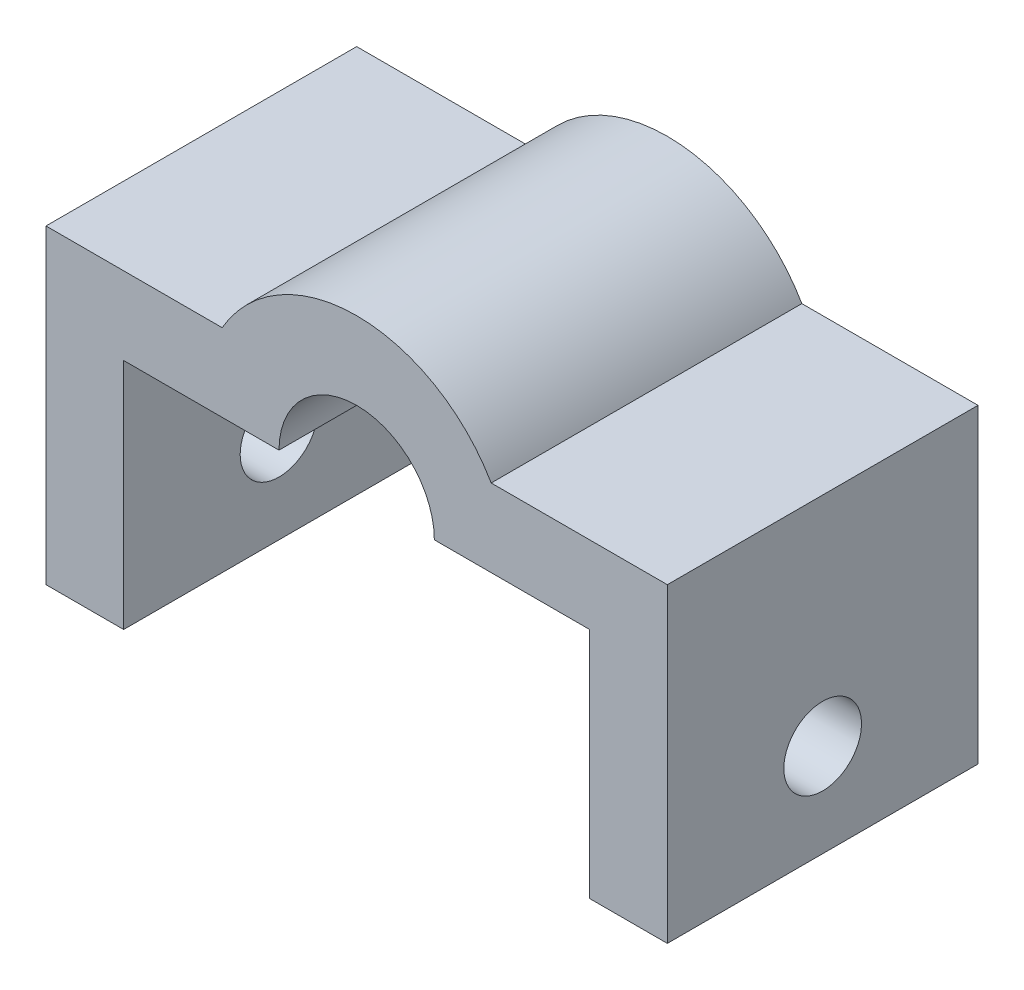
ISO-10303-21;
HEADER;
FILE_DESCRIPTION(('STEP AP214'),'2;1');
FILE_NAME('part.step','',(''),(''),'','','');
FILE_SCHEMA(('AUTOMOTIVE_DESIGN { 1 0 10303 214 1 1 1 1 }'));
ENDSEC;
DATA;
#1=APPLICATION_CONTEXT('core data for automotive mechanical design processes');
#2=APPLICATION_PROTOCOL_DEFINITION('international standard','automotive_design',2000,#1);
#3=PRODUCT_CONTEXT('',#1,'mechanical');
#4=PRODUCT('Part','Part','',(#3));
#5=PRODUCT_RELATED_PRODUCT_CATEGORY('part','',(#4));
#6=PRODUCT_DEFINITION_FORMATION('','',#4);
#7=PRODUCT_DEFINITION_CONTEXT('part definition',#1,'design');
#8=PRODUCT_DEFINITION('design','',#6,#7);
#9=PRODUCT_DEFINITION_SHAPE('','',#8);
#10=(LENGTH_UNIT() NAMED_UNIT(*) SI_UNIT(.MILLI.,.METRE.));
#11=(NAMED_UNIT(*) PLANE_ANGLE_UNIT() SI_UNIT($,.RADIAN.));
#12=(NAMED_UNIT(*) SI_UNIT($,.STERADIAN.) SOLID_ANGLE_UNIT());
#13=UNCERTAINTY_MEASURE_WITH_UNIT(LENGTH_MEASURE(1.E-05),#10,'distance_accuracy_value','');
#14=(GEOMETRIC_REPRESENTATION_CONTEXT(3) GLOBAL_UNCERTAINTY_ASSIGNED_CONTEXT((#13)) GLOBAL_UNIT_ASSIGNED_CONTEXT((#10,
#11,#12)) REPRESENTATION_CONTEXT('',''));
#15=CARTESIAN_POINT('',(0.,0.,0.));
#16=DIRECTION('',(0.,0.,1.));
#17=DIRECTION('',(1.,0.,0.));
#18=AXIS2_PLACEMENT_3D('',#15,#16,#17);
#19=CARTESIAN_POINT('',(-3.175,0.,12.7));
#20=DIRECTION('',(-1.,0.,0.));
#21=DIRECTION('',(0.,0.,1.));
#22=AXIS2_PLACEMENT_3D('',#19,#20,#21);
#23=PLANE('',#22);
#24=CARTESIAN_POINT('',(-3.175,3.81,6.35));
#25=DIRECTION('',(-1.,0.,0.));
#26=DIRECTION('',(0.,0.,1.));
#27=AXIS2_PLACEMENT_3D('',#24,#25,#26);
#28=CIRCLE('',#27,1.5875);
#29=CARTESIAN_POINT('',(-3.175,3.81,7.9375));
#30=VERTEX_POINT('',#29);
#31=EDGE_CURVE('E305',#30,#30,#28,.T.);
#32=ORIENTED_EDGE('',*,*,#31,.F.);
#33=EDGE_LOOP('',(#32));
#34=FACE_BOUND('',#33,.T.);
#35=DIRECTION('',(0.,1.,0.));
#36=VECTOR('',#35,1.);
#37=CARTESIAN_POINT('',(-3.175,0.,0.));
#38=LINE('',#37,#36);
#39=CARTESIAN_POINT('',(-3.175,0.,0.));
#40=VERTEX_POINT('',#39);
#41=CARTESIAN_POINT('',(-3.175,12.7,0.));
#42=VERTEX_POINT('',#41);
#43=EDGE_CURVE('E167',#40,#42,#38,.T.);
#44=ORIENTED_EDGE('',*,*,#43,.F.);
#45=DIRECTION('',(0.,0.,-1.));
#46=VECTOR('',#45,1.);
#47=CARTESIAN_POINT('',(-3.175,0.,12.7));
#48=LINE('',#47,#46);
#49=CARTESIAN_POINT('',(-3.175,0.,12.7));
#50=VERTEX_POINT('',#49);
#51=EDGE_CURVE('E11',#50,#40,#48,.T.);
#52=ORIENTED_EDGE('',*,*,#51,.F.);
#53=DIRECTION('',(0.,1.,0.));
#54=VECTOR('',#53,1.);
#55=CARTESIAN_POINT('',(-3.175,0.,12.7));
#56=LINE('',#55,#54);
#57=CARTESIAN_POINT('',(-3.175,12.7,12.7));
#58=VERTEX_POINT('',#57);
#59=EDGE_CURVE('E207',#50,#58,#56,.T.);
#60=ORIENTED_EDGE('',*,*,#59,.T.);
#61=DIRECTION('',(0.,0.,-1.));
#62=VECTOR('',#61,1.);
#63=CARTESIAN_POINT('',(-3.175,12.7,12.7));
#64=LINE('',#63,#62);
#65=EDGE_CURVE('E107',#58,#42,#64,.T.);
#66=ORIENTED_EDGE('',*,*,#65,.T.);
#67=EDGE_LOOP('',(#44,#52,#60,#66));
#68=FACE_BOUND('',#67,.T.);
#69=ADVANCED_FACE('F39',(#34,#68),#23,.T.);
#70=CARTESIAN_POINT('',(0.,0.,12.7));
#71=DIRECTION('',(0.,-1.,0.));
#72=DIRECTION('',(1.,0.,0.));
#73=AXIS2_PLACEMENT_3D('',#70,#71,#72);
#74=PLANE('',#73);
#75=DIRECTION('',(-1.,0.,0.));
#76=VECTOR('',#75,1.);
#77=CARTESIAN_POINT('',(0.,0.,0.));
#78=LINE('',#77,#76);
#79=CARTESIAN_POINT('',(0.,0.,0.));
#80=VERTEX_POINT('',#79);
#81=EDGE_CURVE('E204',#80,#40,#78,.T.);
#82=ORIENTED_EDGE('',*,*,#81,.F.);
#83=DIRECTION('',(0.,0.,-1.));
#84=VECTOR('',#83,1.);
#85=CARTESIAN_POINT('',(0.,0.,12.7));
#86=LINE('',#85,#84);
#87=CARTESIAN_POINT('',(0.,0.,12.7));
#88=VERTEX_POINT('',#87);
#89=EDGE_CURVE('E49',#88,#80,#86,.T.);
#90=ORIENTED_EDGE('',*,*,#89,.F.);
#91=DIRECTION('',(-1.,0.,0.));
#92=VECTOR('',#91,1.);
#93=CARTESIAN_POINT('',(0.,0.,12.7));
#94=LINE('',#93,#92);
#95=EDGE_CURVE('E142',#88,#50,#94,.T.);
#96=ORIENTED_EDGE('',*,*,#95,.T.);
#97=ORIENTED_EDGE('',*,*,#51,.T.);
#98=EDGE_LOOP('',(#82,#90,#96,#97));
#99=FACE_BOUND('',#98,.T.);
#100=ADVANCED_FACE('F244',(#99),#74,.T.);
#101=CARTESIAN_POINT('',(0.,0.,12.7));
#102=DIRECTION('',(-1.,0.,0.));
#103=DIRECTION('',(0.,0.,1.));
#104=AXIS2_PLACEMENT_3D('',#101,#102,#103);
#105=PLANE('',#104);
#106=CARTESIAN_POINT('',(0.,3.81,6.35));
#107=DIRECTION('',(-1.,0.,0.));
#108=DIRECTION('',(0.,0.,1.));
#109=AXIS2_PLACEMENT_3D('',#106,#107,#108);
#110=CIRCLE('',#109,1.5875);
#111=CARTESIAN_POINT('',(0.,3.81,7.9375));
#112=VERTEX_POINT('',#111);
#113=EDGE_CURVE('E172',#112,#112,#110,.T.);
#114=ORIENTED_EDGE('',*,*,#113,.T.);
#115=EDGE_LOOP('',(#114));
#116=FACE_BOUND('',#115,.T.);
#117=DIRECTION('',(0.,1.,0.));
#118=VECTOR('',#117,1.);
#119=CARTESIAN_POINT('',(0.,0.,0.));
#120=LINE('',#119,#118);
#121=CARTESIAN_POINT('',(0.,9.525,0.));
#122=VERTEX_POINT('',#121);
#123=EDGE_CURVE('E148',#80,#122,#120,.T.);
#124=ORIENTED_EDGE('',*,*,#123,.T.);
#125=DIRECTION('',(0.,0.,-1.));
#126=VECTOR('',#125,1.);
#127=CARTESIAN_POINT('',(0.,9.525,12.7));
#128=LINE('',#127,#126);
#129=CARTESIAN_POINT('',(0.,9.525,12.7));
#130=VERTEX_POINT('',#129);
#131=EDGE_CURVE('E146',#130,#122,#128,.T.);
#132=ORIENTED_EDGE('',*,*,#131,.F.);
#133=DIRECTION('',(0.,1.,0.));
#134=VECTOR('',#133,1.);
#135=CARTESIAN_POINT('',(0.,0.,12.7));
#136=LINE('',#135,#134);
#137=EDGE_CURVE('E135',#88,#130,#136,.T.);
#138=ORIENTED_EDGE('',*,*,#137,.F.);
#139=ORIENTED_EDGE('',*,*,#89,.T.);
#140=EDGE_LOOP('',(#124,#132,#138,#139));
#141=FACE_BOUND('',#140,.T.);
#142=ADVANCED_FACE('F147',(#116,#141),#105,.F.);
#143=CARTESIAN_POINT('',(0.,9.525,12.7));
#144=DIRECTION('',(0.,1.,0.));
#145=DIRECTION('',(0.,0.,1.));
#146=AXIS2_PLACEMENT_3D('',#143,#144,#145);
#147=PLANE('',#146);
#148=DIRECTION('',(1.,0.,0.));
#149=VECTOR('',#148,1.);
#150=CARTESIAN_POINT('',(0.,9.525,0.));
#151=LINE('',#150,#149);
#152=CARTESIAN_POINT('',(6.35,9.525,0.));
#153=VERTEX_POINT('',#152);
#154=EDGE_CURVE('E199',#122,#153,#151,.T.);
#155=ORIENTED_EDGE('',*,*,#154,.T.);
#156=DIRECTION('',(0.,0.,-1.));
#157=VECTOR('',#156,1.);
#158=CARTESIAN_POINT('',(6.35,9.525,12.7));
#159=LINE('',#158,#157);
#160=CARTESIAN_POINT('',(6.35,9.525,12.7));
#161=VERTEX_POINT('',#160);
#162=EDGE_CURVE('E153',#161,#153,#159,.T.);
#163=ORIENTED_EDGE('',*,*,#162,.F.);
#164=DIRECTION('',(1.,0.,0.));
#165=VECTOR('',#164,1.);
#166=CARTESIAN_POINT('',(0.,9.525,12.7));
#167=LINE('',#166,#165);
#168=EDGE_CURVE('E140',#130,#161,#167,.T.);
#169=ORIENTED_EDGE('',*,*,#168,.F.);
#170=ORIENTED_EDGE('',*,*,#131,.T.);
#171=EDGE_LOOP('',(#155,#163,#169,#170));
#172=FACE_BOUND('',#171,.T.);
#173=ADVANCED_FACE('F155',(#172),#147,.F.);
#174=CARTESIAN_POINT('',(9.525,9.525,12.7));
#175=DIRECTION('',(0.,0.,-1.));
#176=DIRECTION('',(-1.,0.,0.));
#177=AXIS2_PLACEMENT_3D('',#174,#175,#176);
#178=CYLINDRICAL_SURFACE('',#177,3.175);
#179=CARTESIAN_POINT('',(9.525,9.525,0.));
#180=DIRECTION('',(0.,0.,1.));
#181=DIRECTION('',(1.,0.,0.));
#182=AXIS2_PLACEMENT_3D('',#179,#180,#181);
#183=CIRCLE('',#182,3.175);
#184=CARTESIAN_POINT('',(12.7,9.525,0.));
#185=VERTEX_POINT('',#184);
#186=EDGE_CURVE('E195',#185,#153,#183,.T.);
#187=ORIENTED_EDGE('',*,*,#186,.F.);
#188=DIRECTION('',(0.,0.,-1.));
#189=VECTOR('',#188,1.);
#190=CARTESIAN_POINT('',(12.7,9.525,12.7));
#191=LINE('',#190,#189);
#192=CARTESIAN_POINT('',(12.7,9.525,12.7));
#193=VERTEX_POINT('',#192);
#194=EDGE_CURVE('E213',#193,#185,#191,.T.);
#195=ORIENTED_EDGE('',*,*,#194,.F.);
#196=CARTESIAN_POINT('',(9.525,9.525,12.7));
#197=DIRECTION('',(0.,0.,1.));
#198=DIRECTION('',(1.,0.,0.));
#199=AXIS2_PLACEMENT_3D('',#196,#197,#198);
#200=CIRCLE('',#199,3.175);
#201=EDGE_CURVE('E158',#193,#161,#200,.T.);
#202=ORIENTED_EDGE('',*,*,#201,.T.);
#203=ORIENTED_EDGE('',*,*,#162,.T.);
#204=EDGE_LOOP('',(#187,#195,#202,#203));
#205=FACE_BOUND('',#204,.T.);
#206=ADVANCED_FACE('F259',(#205),#178,.F.);
#207=CARTESIAN_POINT('',(12.7,9.525,12.7));
#208=DIRECTION('',(0.,1.,0.));
#209=DIRECTION('',(0.,0.,1.));
#210=AXIS2_PLACEMENT_3D('',#207,#208,#209);
#211=PLANE('',#210);
#212=DIRECTION('',(1.,0.,0.));
#213=VECTOR('',#212,1.);
#214=CARTESIAN_POINT('',(12.7,9.525,0.));
#215=LINE('',#214,#213);
#216=CARTESIAN_POINT('',(19.05,9.525,0.));
#217=VERTEX_POINT('',#216);
#218=EDGE_CURVE('E192',#185,#217,#215,.T.);
#219=ORIENTED_EDGE('',*,*,#218,.T.);
#220=DIRECTION('',(0.,0.,-1.));
#221=VECTOR('',#220,1.);
#222=CARTESIAN_POINT('',(19.05,9.525,12.7));
#223=LINE('',#222,#221);
#224=CARTESIAN_POINT('',(19.05,9.525,12.7));
#225=VERTEX_POINT('',#224);
#226=EDGE_CURVE('E216',#225,#217,#223,.T.);
#227=ORIENTED_EDGE('',*,*,#226,.F.);
#228=DIRECTION('',(1.,0.,0.));
#229=VECTOR('',#228,1.);
#230=CARTESIAN_POINT('',(12.7,9.525,12.7));
#231=LINE('',#230,#229);
#232=EDGE_CURVE('E161',#193,#225,#231,.T.);
#233=ORIENTED_EDGE('',*,*,#232,.F.);
#234=ORIENTED_EDGE('',*,*,#194,.T.);
#235=EDGE_LOOP('',(#219,#227,#233,#234));
#236=FACE_BOUND('',#235,.T.);
#237=ADVANCED_FACE('F262',(#236),#211,.F.);
#238=CARTESIAN_POINT('',(19.05,9.525,12.7));
#239=DIRECTION('',(1.,0.,0.));
#240=DIRECTION('',(0.,0.,-1.));
#241=AXIS2_PLACEMENT_3D('',#238,#239,#240);
#242=PLANE('',#241);
#243=CARTESIAN_POINT('',(19.05,3.81,6.35));
#244=DIRECTION('',(1.,0.,0.));
#245=DIRECTION('',(0.,0.,-1.));
#246=AXIS2_PLACEMENT_3D('',#243,#244,#245);
#247=CIRCLE('',#246,1.5875);
#248=CARTESIAN_POINT('',(19.05,3.81,7.9375));
#249=VERTEX_POINT('',#248);
#250=EDGE_CURVE('E309',#249,#249,#247,.T.);
#251=ORIENTED_EDGE('',*,*,#250,.T.);
#252=EDGE_LOOP('',(#251));
#253=FACE_BOUND('',#252,.T.);
#254=DIRECTION('',(0.,-1.,0.));
#255=VECTOR('',#254,1.);
#256=CARTESIAN_POINT('',(19.05,9.525,0.));
#257=LINE('',#256,#255);
#258=CARTESIAN_POINT('',(19.05,0.,0.));
#259=VERTEX_POINT('',#258);
#260=EDGE_CURVE('E189',#217,#259,#257,.T.);
#261=ORIENTED_EDGE('',*,*,#260,.T.);
#262=DIRECTION('',(0.,0.,-1.));
#263=VECTOR('',#262,1.);
#264=CARTESIAN_POINT('',(19.05,0.,12.7));
#265=LINE('',#264,#263);
#266=CARTESIAN_POINT('',(19.05,0.,12.7));
#267=VERTEX_POINT('',#266);
#268=EDGE_CURVE('E220',#267,#259,#265,.T.);
#269=ORIENTED_EDGE('',*,*,#268,.F.);
#270=DIRECTION('',(0.,-1.,0.));
#271=VECTOR('',#270,1.);
#272=CARTESIAN_POINT('',(19.05,9.525,12.7));
#273=LINE('',#272,#271);
#274=EDGE_CURVE('E333',#225,#267,#273,.T.);
#275=ORIENTED_EDGE('',*,*,#274,.F.);
#276=ORIENTED_EDGE('',*,*,#226,.T.);
#277=EDGE_LOOP('',(#261,#269,#275,#276));
#278=FACE_BOUND('',#277,.T.);
#279=ADVANCED_FACE('F266',(#253,#278),#242,.F.);
#280=CARTESIAN_POINT('',(19.05,0.,12.7));
#281=DIRECTION('',(0.,1.,0.));
#282=DIRECTION('',(0.,0.,1.));
#283=AXIS2_PLACEMENT_3D('',#280,#281,#282);
#284=PLANE('',#283);
#285=DIRECTION('',(1.,0.,0.));
#286=VECTOR('',#285,1.);
#287=CARTESIAN_POINT('',(19.05,0.,0.));
#288=LINE('',#287,#286);
#289=CARTESIAN_POINT('',(22.225,0.,0.));
#290=VERTEX_POINT('',#289);
#291=EDGE_CURVE('E186',#259,#290,#288,.T.);
#292=ORIENTED_EDGE('',*,*,#291,.T.);
#293=DIRECTION('',(0.,0.,-1.));
#294=VECTOR('',#293,1.);
#295=CARTESIAN_POINT('',(22.225,0.,12.7));
#296=LINE('',#295,#294);
#297=CARTESIAN_POINT('',(22.225,0.,12.7));
#298=VERTEX_POINT('',#297);
#299=EDGE_CURVE('E224',#298,#290,#296,.T.);
#300=ORIENTED_EDGE('',*,*,#299,.F.);
#301=DIRECTION('',(1.,0.,0.));
#302=VECTOR('',#301,1.);
#303=CARTESIAN_POINT('',(19.05,0.,12.7));
#304=LINE('',#303,#302);
#305=EDGE_CURVE('E330',#267,#298,#304,.T.);
#306=ORIENTED_EDGE('',*,*,#305,.F.);
#307=ORIENTED_EDGE('',*,*,#268,.T.);
#308=EDGE_LOOP('',(#292,#300,#306,#307));
#309=FACE_BOUND('',#308,.T.);
#310=ADVANCED_FACE('F270',(#309),#284,.F.);
#311=CARTESIAN_POINT('',(22.225,0.,12.7));
#312=DIRECTION('',(-1.,0.,0.));
#313=DIRECTION('',(0.,0.,1.));
#314=AXIS2_PLACEMENT_3D('',#311,#312,#313);
#315=PLANE('',#314);
#316=CARTESIAN_POINT('',(22.225,3.81,6.35));
#317=DIRECTION('',(-1.,0.,0.));
#318=DIRECTION('',(0.,0.,1.));
#319=AXIS2_PLACEMENT_3D('',#316,#317,#318);
#320=CIRCLE('',#319,1.5875);
#321=CARTESIAN_POINT('',(22.225,3.81,7.9375));
#322=VERTEX_POINT('',#321);
#323=EDGE_CURVE('E42',#322,#322,#320,.T.);
#324=ORIENTED_EDGE('',*,*,#323,.T.);
#325=EDGE_LOOP('',(#324));
#326=FACE_BOUND('',#325,.T.);
#327=DIRECTION('',(0.,1.,0.));
#328=VECTOR('',#327,1.);
#329=CARTESIAN_POINT('',(22.225,0.,0.));
#330=LINE('',#329,#328);
#331=CARTESIAN_POINT('',(22.225,12.7,0.));
#332=VERTEX_POINT('',#331);
#333=EDGE_CURVE('E183',#290,#332,#330,.T.);
#334=ORIENTED_EDGE('',*,*,#333,.T.);
#335=DIRECTION('',(0.,0.,-1.));
#336=VECTOR('',#335,1.);
#337=CARTESIAN_POINT('',(22.225,12.7,12.7));
#338=LINE('',#337,#336);
#339=CARTESIAN_POINT('',(22.225,12.7,12.7));
#340=VERTEX_POINT('',#339);
#341=EDGE_CURVE('E228',#340,#332,#338,.T.);
#342=ORIENTED_EDGE('',*,*,#341,.F.);
#343=DIRECTION('',(0.,1.,0.));
#344=VECTOR('',#343,1.);
#345=CARTESIAN_POINT('',(22.225,0.,12.7));
#346=LINE('',#345,#344);
#347=EDGE_CURVE('E327',#298,#340,#346,.T.);
#348=ORIENTED_EDGE('',*,*,#347,.F.);
#349=ORIENTED_EDGE('',*,*,#299,.T.);
#350=EDGE_LOOP('',(#334,#342,#348,#349));
#351=FACE_BOUND('',#350,.T.);
#352=ADVANCED_FACE('F274',(#326,#351),#315,.F.);
#353=CARTESIAN_POINT('',(22.225,12.7,12.7));
#354=DIRECTION('',(0.,-1.,0.));
#355=DIRECTION('',(1.,0.,0.));
#356=AXIS2_PLACEMENT_3D('',#353,#354,#355);
#357=PLANE('',#356);
#358=DIRECTION('',(-1.,0.,0.));
#359=VECTOR('',#358,1.);
#360=CARTESIAN_POINT('',(22.225,12.7,0.));
#361=LINE('',#360,#359);
#362=CARTESIAN_POINT('',(15.0242613140312,12.7,0.));
#363=VERTEX_POINT('',#362);
#364=EDGE_CURVE('E180',#332,#363,#361,.T.);
#365=ORIENTED_EDGE('',*,*,#364,.T.);
#366=DIRECTION('',(0.,0.,-1.));
#367=VECTOR('',#366,1.);
#368=CARTESIAN_POINT('',(15.0242613140312,12.7,12.7));
#369=LINE('',#368,#367);
#370=CARTESIAN_POINT('',(15.0242613140312,12.7,12.7));
#371=VERTEX_POINT('',#370);
#372=EDGE_CURVE('E232',#371,#363,#369,.T.);
#373=ORIENTED_EDGE('',*,*,#372,.F.);
#374=DIRECTION('',(-1.,0.,0.));
#375=VECTOR('',#374,1.);
#376=CARTESIAN_POINT('',(22.225,12.7,12.7));
#377=LINE('',#376,#375);
#378=EDGE_CURVE('E324',#340,#371,#377,.T.);
#379=ORIENTED_EDGE('',*,*,#378,.F.);
#380=ORIENTED_EDGE('',*,*,#341,.T.);
#381=EDGE_LOOP('',(#365,#373,#379,#380));
#382=FACE_BOUND('',#381,.T.);
#383=ADVANCED_FACE('F278',(#382),#357,.F.);
#384=CARTESIAN_POINT('',(9.525,9.525,12.7));
#385=DIRECTION('',(0.,0.,-1.));
#386=DIRECTION('',(-1.,0.,0.));
#387=AXIS2_PLACEMENT_3D('',#384,#385,#386);
#388=CYLINDRICAL_SURFACE('',#387,6.35);
#389=CARTESIAN_POINT('',(9.525,9.525,0.));
#390=DIRECTION('',(0.,0.,1.));
#391=DIRECTION('',(1.,0.,0.));
#392=AXIS2_PLACEMENT_3D('',#389,#390,#391);
#393=CIRCLE('',#392,6.35);
#394=CARTESIAN_POINT('',(4.02573868596881,12.7,0.));
#395=VERTEX_POINT('',#394);
#396=EDGE_CURVE('E176',#363,#395,#393,.T.);
#397=ORIENTED_EDGE('',*,*,#396,.T.);
#398=DIRECTION('',(0.,0.,-1.));
#399=VECTOR('',#398,1.);
#400=CARTESIAN_POINT('',(4.02573868596881,12.7,12.7));
#401=LINE('',#400,#399);
#402=CARTESIAN_POINT('',(4.02573868596881,12.7,12.7));
#403=VERTEX_POINT('',#402);
#404=EDGE_CURVE('E236',#403,#395,#401,.T.);
#405=ORIENTED_EDGE('',*,*,#404,.F.);
#406=CARTESIAN_POINT('',(9.525,9.525,12.7));
#407=DIRECTION('',(0.,0.,1.));
#408=DIRECTION('',(1.,0.,0.));
#409=AXIS2_PLACEMENT_3D('',#406,#407,#408);
#410=CIRCLE('',#409,6.35);
#411=EDGE_CURVE('E321',#371,#403,#410,.T.);
#412=ORIENTED_EDGE('',*,*,#411,.F.);
#413=ORIENTED_EDGE('',*,*,#372,.T.);
#414=EDGE_LOOP('',(#397,#405,#412,#413));
#415=FACE_BOUND('',#414,.T.);
#416=ADVANCED_FACE('F282',(#415),#388,.T.);
#417=CARTESIAN_POINT('',(-3.175,12.7,12.7));
#418=DIRECTION('',(0.,1.,0.));
#419=DIRECTION('',(0.,0.,1.));
#420=AXIS2_PLACEMENT_3D('',#417,#418,#419);
#421=PLANE('',#420);
#422=DIRECTION('',(1.,0.,0.));
#423=VECTOR('',#422,1.);
#424=CARTESIAN_POINT('',(-3.175,12.7,0.));
#425=LINE('',#424,#423);
#426=EDGE_CURVE('E171',#42,#395,#425,.T.);
#427=ORIENTED_EDGE('',*,*,#426,.F.);
#428=ORIENTED_EDGE('',*,*,#65,.F.);
#429=DIRECTION('',(1.,0.,0.));
#430=VECTOR('',#429,1.);
#431=CARTESIAN_POINT('',(-3.175,12.7,12.7));
#432=LINE('',#431,#430);
#433=EDGE_CURVE('E318',#58,#403,#432,.T.);
#434=ORIENTED_EDGE('',*,*,#433,.T.);
#435=ORIENTED_EDGE('',*,*,#404,.T.);
#436=EDGE_LOOP('',(#427,#428,#434,#435));
#437=FACE_BOUND('',#436,.T.);
#438=ADVANCED_FACE('F239',(#437),#421,.T.);
#439=CARTESIAN_POINT('',(9.525,9.525,12.7));
#440=DIRECTION('',(0.,0.,1.));
#441=DIRECTION('',(1.,0.,0.));
#442=AXIS2_PLACEMENT_3D('',#439,#440,#441);
#443=PLANE('',#442);
#444=ORIENTED_EDGE('',*,*,#59,.F.);
#445=ORIENTED_EDGE('',*,*,#95,.F.);
#446=ORIENTED_EDGE('',*,*,#137,.T.);
#447=ORIENTED_EDGE('',*,*,#168,.T.);
#448=ORIENTED_EDGE('',*,*,#201,.F.);
#449=ORIENTED_EDGE('',*,*,#232,.T.);
#450=ORIENTED_EDGE('',*,*,#274,.T.);
#451=ORIENTED_EDGE('',*,*,#305,.T.);
#452=ORIENTED_EDGE('',*,*,#347,.T.);
#453=ORIENTED_EDGE('',*,*,#378,.T.);
#454=ORIENTED_EDGE('',*,*,#411,.T.);
#455=ORIENTED_EDGE('',*,*,#433,.F.);
#456=EDGE_LOOP('',(#444,#445,#446,#447,#448,#449,#450,#451,#452,#453,#454,#455));
#457=FACE_BOUND('',#456,.T.);
#458=ADVANCED_FACE('F137',(#457),#443,.T.);
#459=CARTESIAN_POINT('',(9.525,9.525,0.));
#460=DIRECTION('',(0.,0.,1.));
#461=DIRECTION('',(1.,0.,0.));
#462=AXIS2_PLACEMENT_3D('',#459,#460,#461);
#463=PLANE('',#462);
#464=ORIENTED_EDGE('',*,*,#43,.T.);
#465=ORIENTED_EDGE('',*,*,#426,.T.);
#466=ORIENTED_EDGE('',*,*,#396,.F.);
#467=ORIENTED_EDGE('',*,*,#364,.F.);
#468=ORIENTED_EDGE('',*,*,#333,.F.);
#469=ORIENTED_EDGE('',*,*,#291,.F.);
#470=ORIENTED_EDGE('',*,*,#260,.F.);
#471=ORIENTED_EDGE('',*,*,#218,.F.);
#472=ORIENTED_EDGE('',*,*,#186,.T.);
#473=ORIENTED_EDGE('',*,*,#154,.F.);
#474=ORIENTED_EDGE('',*,*,#123,.F.);
#475=ORIENTED_EDGE('',*,*,#81,.T.);
#476=EDGE_LOOP('',(#464,#465,#466,#467,#468,#469,#470,#471,#472,#473,#474,#475));
#477=FACE_BOUND('',#476,.T.);
#478=ADVANCED_FACE('F243',(#477),#463,.F.);
#479=CARTESIAN_POINT('',(73.025,3.81,6.35));
#480=DIRECTION('',(-1.,0.,0.));
#481=DIRECTION('',(0.,0.,1.));
#482=AXIS2_PLACEMENT_3D('',#479,#480,#481);
#483=CYLINDRICAL_SURFACE('',#482,1.5875);
#484=CARTESIAN_POINT('',(22.225,3.81,7.9375));
#485=CARTESIAN_POINT('',(22.1919270833333,3.81,7.9375));
#486=CARTESIAN_POINT('',(22.1588541666667,3.81,7.9375));
#487=CARTESIAN_POINT('',(22.0927083333333,3.81,7.9375));
#488=CARTESIAN_POINT('',(22.0596354166667,3.81,7.9375));
#489=CARTESIAN_POINT('',(21.9934895833333,3.81,7.9375));
#490=CARTESIAN_POINT('',(21.9604166666667,3.81,7.9375));
#491=CARTESIAN_POINT('',(21.8942708333333,3.81,7.9375));
#492=CARTESIAN_POINT('',(21.8611979166667,3.81,7.9375));
#493=CARTESIAN_POINT('',(21.7950520833333,3.81,7.9375));
#494=CARTESIAN_POINT('',(21.7619791666667,3.81,7.9375));
#495=CARTESIAN_POINT('',(21.6958333333333,3.81,7.9375));
#496=CARTESIAN_POINT('',(21.6627604166667,3.81,7.9375));
#497=CARTESIAN_POINT('',(21.5966145833333,3.81,7.9375));
#498=CARTESIAN_POINT('',(21.5635416666667,3.81,7.9375));
#499=CARTESIAN_POINT('',(21.4973958333333,3.81,7.9375));
#500=CARTESIAN_POINT('',(21.4643229166667,3.81,7.9375));
#501=CARTESIAN_POINT('',(21.3981770833333,3.81,7.9375));
#502=CARTESIAN_POINT('',(21.3651041666667,3.81,7.9375));
#503=CARTESIAN_POINT('',(21.2989583333333,3.81,7.9375));
#504=CARTESIAN_POINT('',(21.2658854166667,3.81,7.9375));
#505=CARTESIAN_POINT('',(21.1997395833333,3.81,7.9375));
#506=CARTESIAN_POINT('',(21.1666666666667,3.81,7.9375));
#507=CARTESIAN_POINT('',(21.1005208333333,3.81,7.9375));
#508=CARTESIAN_POINT('',(21.0674479166667,3.81,7.9375));
#509=CARTESIAN_POINT('',(21.0013020833333,3.81,7.9375));
#510=CARTESIAN_POINT('',(20.9682291666667,3.81,7.9375));
#511=CARTESIAN_POINT('',(20.9020833333333,3.81,7.9375));
#512=CARTESIAN_POINT('',(20.8690104166667,3.81,7.9375));
#513=CARTESIAN_POINT('',(20.8028645833333,3.81,7.9375));
#514=CARTESIAN_POINT('',(20.7697916666667,3.81,7.9375));
#515=CARTESIAN_POINT('',(20.7036458333333,3.81,7.9375));
#516=CARTESIAN_POINT('',(20.6705729166667,3.81,7.9375));
#517=CARTESIAN_POINT('',(20.6044270833333,3.81,7.9375));
#518=CARTESIAN_POINT('',(20.5713541666667,3.81,7.9375));
#519=CARTESIAN_POINT('',(20.5052083333333,3.81,7.9375));
#520=CARTESIAN_POINT('',(20.4721354166667,3.81,7.9375));
#521=CARTESIAN_POINT('',(20.4059895833333,3.81,7.9375));
#522=CARTESIAN_POINT('',(20.3729166666667,3.81,7.9375));
#523=CARTESIAN_POINT('',(20.3067708333333,3.81,7.9375));
#524=CARTESIAN_POINT('',(20.2736979166667,3.81,7.9375));
#525=CARTESIAN_POINT('',(20.2075520833333,3.81,7.9375));
#526=CARTESIAN_POINT('',(20.1744791666667,3.81,7.9375));
#527=CARTESIAN_POINT('',(20.1083333333333,3.81,7.9375));
#528=CARTESIAN_POINT('',(20.0752604166667,3.81,7.9375));
#529=CARTESIAN_POINT('',(20.0091145833333,3.81,7.9375));
#530=CARTESIAN_POINT('',(19.9760416666667,3.81,7.9375));
#531=CARTESIAN_POINT('',(19.9098958333333,3.81,7.9375));
#532=CARTESIAN_POINT('',(19.8768229166667,3.81,7.9375));
#533=CARTESIAN_POINT('',(19.8106770833333,3.81,7.9375));
#534=CARTESIAN_POINT('',(19.7776041666667,3.81,7.9375));
#535=CARTESIAN_POINT('',(19.7114583333333,3.81,7.9375));
#536=CARTESIAN_POINT('',(19.6783854166667,3.81,7.9375));
#537=CARTESIAN_POINT('',(19.6122395833333,3.81,7.9375));
#538=CARTESIAN_POINT('',(19.5791666666667,3.81,7.9375));
#539=CARTESIAN_POINT('',(19.5130208333333,3.81,7.9375));
#540=CARTESIAN_POINT('',(19.4799479166667,3.81,7.9375));
#541=CARTESIAN_POINT('',(19.4138020833333,3.81,7.9375));
#542=CARTESIAN_POINT('',(19.3807291666667,3.81,7.9375));
#543=CARTESIAN_POINT('',(19.3145833333333,3.81,7.9375));
#544=CARTESIAN_POINT('',(19.2815104166667,3.81,7.9375));
#545=CARTESIAN_POINT('',(19.2153645833333,3.81,7.9375));
#546=CARTESIAN_POINT('',(19.1822916666667,3.81,7.9375));
#547=CARTESIAN_POINT('',(19.1161458333333,3.81,7.9375));
#548=CARTESIAN_POINT('',(19.0830729166667,3.81,7.9375));
#549=CARTESIAN_POINT('',(19.05,3.81,7.9375));
#550=B_SPLINE_CURVE_WITH_KNOTS('',3,(#484,#485,#486,#487,#488,#489,#490,#491,#492,#493,#494,
#495,#496,#497,#498,#499,#500,#501,#502,#503,#504,#505,#506,#507,#508,#509,#510,#511,#512,#513,
#514,#515,#516,#517,#518,#519,#520,#521,#522,#523,#524,#525,#526,#527,#528,#529,#530,#531,#532,
#533,#534,#535,#536,#537,#538,#539,#540,#541,#542,#543,#544,#545,#546,#547,#548,#549),
.UNSPECIFIED.,.F.,.F.,(4,2,2,2,2,2,2,2,2,2,2,2,2,2,2,2,2,2,2,2,2,2,2,2,2,2,2,2,2,2,2,2,4),(0.,
0.0992187499999977,0.198437500000002,0.29765625,0.396875000000005,0.496093750000003,0.5953125,
0.694531250000005,0.793750000000003,0.892968750000001,0.992187500000005,1.09140625,1.190625,
1.28984375000001,1.3890625,1.48828125000001,1.58750000000001,1.68671875,1.78593750000001,
1.88515625000001,1.98437500000001,2.08359375000001,2.18281250000001,2.28203125000001,
2.38125000000001,2.48046875000001,2.57968750000001,2.67890625000001,2.77812500000001,
2.87734375000001,2.97656250000001,3.07578125000001,3.17500000000001),.UNSPECIFIED.);
#551=EDGE_CURVE('BSEAM293',#322,#249,#550,.T.);
#552=ORIENTED_EDGE('',*,*,#323,.F.);
#553=ORIENTED_EDGE('',*,*,#250,.F.);
#554=ORIENTED_EDGE('',*,*,#551,.T.);
#555=ORIENTED_EDGE('',*,*,#551,.F.);
#556=EDGE_LOOP('',(#552,#554,#553,#555));
#557=FACE_BOUND('',#556,.T.);
#558=ADVANCED_FACE('F293',(#557),#483,.F.);
#559=CARTESIAN_POINT('',(-3.175,3.81,7.9375));
#560=CARTESIAN_POINT('',(-3.14192708333333,3.81,7.9375));
#561=CARTESIAN_POINT('',(-3.10885416666666,3.81,7.9375));
#562=CARTESIAN_POINT('',(-3.04270833333333,3.81,7.9375));
#563=CARTESIAN_POINT('',(-3.00963541666667,3.81,7.9375));
#564=CARTESIAN_POINT('',(-2.94348958333333,3.81,7.9375));
#565=CARTESIAN_POINT('',(-2.91041666666667,3.81,7.9375));
#566=CARTESIAN_POINT('',(-2.84427083333333,3.81,7.9375));
#567=CARTESIAN_POINT('',(-2.81119791666666,3.81,7.9375));
#568=CARTESIAN_POINT('',(-2.74505208333333,3.81,7.9375));
#569=CARTESIAN_POINT('',(-2.71197916666667,3.81,7.9375));
#570=CARTESIAN_POINT('',(-2.64583333333333,3.81,7.9375));
#571=CARTESIAN_POINT('',(-2.61276041666667,3.81,7.9375));
#572=CARTESIAN_POINT('',(-2.54661458333333,3.81,7.9375));
#573=CARTESIAN_POINT('',(-2.51354166666666,3.81,7.9375));
#574=CARTESIAN_POINT('',(-2.44739583333332,3.81,7.9375));
#575=CARTESIAN_POINT('',(-2.41432291666666,3.81,7.9375));
#576=CARTESIAN_POINT('',(-2.34817708333332,3.81,7.9375));
#577=CARTESIAN_POINT('',(-2.31510416666666,3.81,7.9375));
#578=CARTESIAN_POINT('',(-2.24895833333333,3.81,7.9375));
#579=CARTESIAN_POINT('',(-2.21588541666666,3.81,7.9375));
#580=CARTESIAN_POINT('',(-2.14973958333332,3.81,7.9375));
#581=CARTESIAN_POINT('',(-2.11666666666666,3.81,7.9375));
#582=CARTESIAN_POINT('',(-2.05052083333332,3.81,7.9375));
#583=CARTESIAN_POINT('',(-2.01744791666666,3.81,7.9375));
#584=CARTESIAN_POINT('',(-1.95130208333333,3.81,7.9375));
#585=CARTESIAN_POINT('',(-1.91822916666666,3.81,7.9375));
#586=CARTESIAN_POINT('',(-1.85208333333332,3.81,7.9375));
#587=CARTESIAN_POINT('',(-1.81901041666666,3.81,7.9375));
#588=CARTESIAN_POINT('',(-1.75286458333332,3.81,7.9375));
#589=CARTESIAN_POINT('',(-1.71979166666666,3.81,7.9375));
#590=CARTESIAN_POINT('',(-1.65364583333333,3.81,7.9375));
#591=CARTESIAN_POINT('',(-1.62057291666666,3.81,7.9375));
#592=CARTESIAN_POINT('',(-1.55442708333332,3.81,7.9375));
#593=CARTESIAN_POINT('',(-1.52135416666666,3.81,7.9375));
#594=CARTESIAN_POINT('',(-1.45520833333332,3.81,7.9375));
#595=CARTESIAN_POINT('',(-1.42213541666666,3.81,7.9375));
#596=CARTESIAN_POINT('',(-1.35598958333333,3.81,7.9375));
#597=CARTESIAN_POINT('',(-1.32291666666666,3.81,7.9375));
#598=CARTESIAN_POINT('',(-1.25677083333332,3.81,7.9375));
#599=CARTESIAN_POINT('',(-1.22369791666666,3.81,7.9375));
#600=CARTESIAN_POINT('',(-1.15755208333332,3.81,7.9375));
#601=CARTESIAN_POINT('',(-1.12447916666666,3.81,7.9375));
#602=CARTESIAN_POINT('',(-1.05833333333333,3.81,7.9375));
#603=CARTESIAN_POINT('',(-1.02526041666666,3.81,7.9375));
#604=CARTESIAN_POINT('',(-0.959114583333323,3.81,7.9375));
#605=CARTESIAN_POINT('',(-0.926041666666655,3.81,7.9375));
#606=CARTESIAN_POINT('',(-0.859895833333323,3.81,7.9375));
#607=CARTESIAN_POINT('',(-0.826822916666659,3.81,7.9375));
#608=CARTESIAN_POINT('',(-0.760677083333328,3.81,7.9375));
#609=CARTESIAN_POINT('',(-0.727604166666659,3.81,7.9375));
#610=CARTESIAN_POINT('',(-0.661458333333323,3.81,7.9375));
#611=CARTESIAN_POINT('',(-0.628385416666655,3.81,7.9375));
#612=CARTESIAN_POINT('',(-0.562239583333318,3.81,7.9375));
#613=CARTESIAN_POINT('',(-0.52916666666665,3.81,7.9375));
#614=CARTESIAN_POINT('',(-0.463020833333318,3.81,7.9375));
#615=CARTESIAN_POINT('',(-0.429947916666655,3.81,7.9375));
#616=CARTESIAN_POINT('',(-0.363802083333323,3.81,7.9375));
#617=CARTESIAN_POINT('',(-0.330729166666655,3.81,7.9375));
#618=CARTESIAN_POINT('',(-0.264583333333318,3.81,7.9375));
#619=CARTESIAN_POINT('',(-0.23151041666665,3.81,7.9375));
#620=CARTESIAN_POINT('',(-0.165364583333318,3.81,7.9375));
#621=CARTESIAN_POINT('',(-0.132291666666654,3.81,7.9375));
#622=CARTESIAN_POINT('',(-0.0661458333333226,3.81,7.9375));
#623=CARTESIAN_POINT('',(-0.0330729166666544,3.81,7.9375));
#624=CARTESIAN_POINT('',(0.,3.81,7.9375));
#625=B_SPLINE_CURVE_WITH_KNOTS('',3,(#559,#560,#561,#562,#563,#564,#565,#566,#567,#568,#569,
#570,#571,#572,#573,#574,#575,#576,#577,#578,#579,#580,#581,#582,#583,#584,#585,#586,#587,#588,
#589,#590,#591,#592,#593,#594,#595,#596,#597,#598,#599,#600,#601,#602,#603,#604,#605,#606,#607,
#608,#609,#610,#611,#612,#613,#614,#615,#616,#617,#618,#619,#620,#621,#622,#623,#624),
.UNSPECIFIED.,.F.,.F.,(4,2,2,2,2,2,2,2,2,2,2,2,2,2,2,2,2,2,2,2,2,2,2,2,2,2,2,2,2,2,2,2,4),(0.,
0.0992187500000047,0.198437499999995,0.29765625,0.396875000000005,0.496093749999996,0.5953125,
0.694531250000005,0.79375000000001,0.892968750000001,0.992187500000005,1.09140625000001,
1.190625,1.28984375000001,1.38906250000001,1.48828125,1.58750000000001,1.68671875000001,
1.7859375,1.88515625000001,1.98437500000001,2.08359375,2.18281250000001,2.28203125000001,
2.38125,2.48046875000001,2.57968750000001,2.67890625000002,2.77812500000001,2.87734375000001,
2.97656250000002,3.07578125000001,3.17500000000001),.UNSPECIFIED.);
#626=EDGE_CURVE('BSEAM295',#30,#112,#625,.T.);
#627=ORIENTED_EDGE('',*,*,#31,.T.);
#628=ORIENTED_EDGE('',*,*,#113,.F.);
#629=ORIENTED_EDGE('',*,*,#626,.T.);
#630=ORIENTED_EDGE('',*,*,#626,.F.);
#631=EDGE_LOOP('',(#627,#629,#628,#630));
#632=FACE_BOUND('',#631,.T.);
#633=ADVANCED_FACE('F295',(#632),#483,.F.);
#634=CLOSED_SHELL('',(#69,#100,#142,#173,#206,#237,#279,#310,#352,#383,#416,#438,#458,#478,#558,#633));
#635=MANIFOLD_SOLID_BREP('B2',#634);
#636=ADVANCED_BREP_SHAPE_REPRESENTATION('',(#18,#635),#14);
#637=SHAPE_DEFINITION_REPRESENTATION(#9,#636);
ENDSEC;
END-ISO-10303-21;
